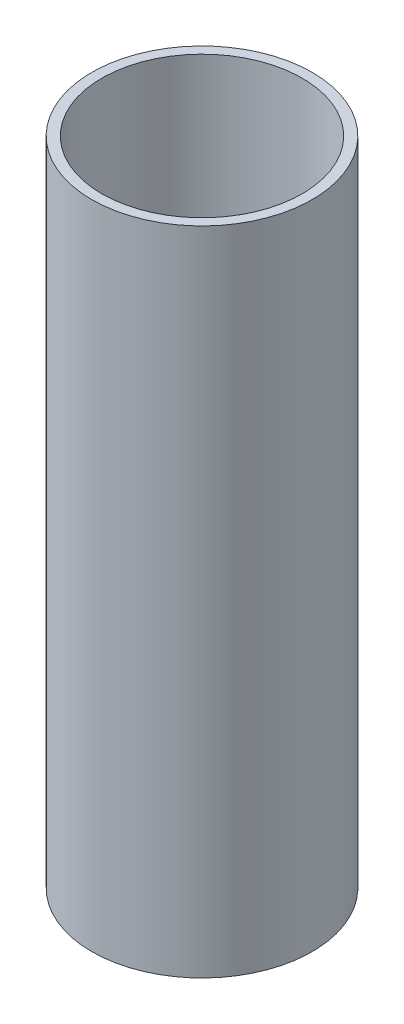
ISO-10303-21;
HEADER;
FILE_DESCRIPTION(('STEP AP214'),'2;1');
FILE_NAME('part.step','',(''),(''),'','','');
FILE_SCHEMA(('AUTOMOTIVE_DESIGN { 1 0 10303 214 1 1 1 1 }'));
ENDSEC;
DATA;
#1=APPLICATION_CONTEXT('core data for automotive mechanical design processes');
#2=APPLICATION_PROTOCOL_DEFINITION('international standard','automotive_design',2000,#1);
#3=PRODUCT_CONTEXT('',#1,'mechanical');
#4=PRODUCT('Part','Part','',(#3));
#5=PRODUCT_RELATED_PRODUCT_CATEGORY('part','',(#4));
#6=PRODUCT_DEFINITION_FORMATION('','',#4);
#7=PRODUCT_DEFINITION_CONTEXT('part definition',#1,'design');
#8=PRODUCT_DEFINITION('design','',#6,#7);
#9=PRODUCT_DEFINITION_SHAPE('','',#8);
#10=(LENGTH_UNIT() NAMED_UNIT(*) SI_UNIT(.MILLI.,.METRE.));
#11=(NAMED_UNIT(*) PLANE_ANGLE_UNIT() SI_UNIT($,.RADIAN.));
#12=(NAMED_UNIT(*) SI_UNIT($,.STERADIAN.) SOLID_ANGLE_UNIT());
#13=UNCERTAINTY_MEASURE_WITH_UNIT(LENGTH_MEASURE(1.E-05),#10,'distance_accuracy_value','');
#14=(GEOMETRIC_REPRESENTATION_CONTEXT(3) GLOBAL_UNCERTAINTY_ASSIGNED_CONTEXT((#13)) GLOBAL_UNIT_ASSIGNED_CONTEXT((#10,
#11,#12)) REPRESENTATION_CONTEXT('',''));
#15=CARTESIAN_POINT('',(0.,0.,0.));
#16=DIRECTION('',(0.,0.,1.));
#17=DIRECTION('',(1.,0.,0.));
#18=AXIS2_PLACEMENT_3D('',#15,#16,#17);
#19=CARTESIAN_POINT('',(0.,65.,0.));
#20=DIRECTION('',(0.,-1.,0.));
#21=DIRECTION('',(0.,0.,-1.));
#22=AXIS2_PLACEMENT_3D('',#19,#20,#21);
#23=CYLINDRICAL_SURFACE('',#22,11.);
#24=CARTESIAN_POINT('',(0.,65.,0.));
#25=DIRECTION('',(0.,1.,0.));
#26=DIRECTION('',(0.,0.,1.));
#27=AXIS2_PLACEMENT_3D('',#24,#25,#26);
#28=CIRCLE('',#27,11.);
#29=CARTESIAN_POINT('',(0.,65.,11.));
#30=VERTEX_POINT('',#29);
#31=EDGE_CURVE('E10',#30,#30,#28,.T.);
#32=ORIENTED_EDGE('',*,*,#31,.F.);
#33=EDGE_LOOP('',(#32));
#34=FACE_BOUND('',#33,.T.);
#35=CARTESIAN_POINT('',(0.,0.,0.));
#36=DIRECTION('',(0.,1.,0.));
#37=DIRECTION('',(0.,0.,1.));
#38=AXIS2_PLACEMENT_3D('',#35,#36,#37);
#39=CIRCLE('',#38,11.);
#40=CARTESIAN_POINT('',(0.,0.,11.));
#41=VERTEX_POINT('',#40);
#42=EDGE_CURVE('E42',#41,#41,#39,.T.);
#43=ORIENTED_EDGE('',*,*,#42,.T.);
#44=EDGE_LOOP('',(#43));
#45=FACE_BOUND('',#44,.T.);
#46=ADVANCED_FACE('F39',(#34,#45),#23,.T.);
#47=CARTESIAN_POINT('',(0.,65.,0.));
#48=DIRECTION('',(0.,1.,0.));
#49=DIRECTION('',(0.,0.,1.));
#50=AXIS2_PLACEMENT_3D('',#47,#48,#49);
#51=PLANE('',#50);
#52=CARTESIAN_POINT('',(0.,65.,0.));
#53=DIRECTION('',(0.,1.,0.));
#54=DIRECTION('',(0.,0.,1.));
#55=AXIS2_PLACEMENT_3D('',#52,#53,#54);
#56=CIRCLE('',#55,10.);
#57=CARTESIAN_POINT('',(0.,65.,10.));
#58=VERTEX_POINT('',#57);
#59=EDGE_CURVE('E51',#58,#58,#56,.T.);
#60=ORIENTED_EDGE('',*,*,#59,.F.);
#61=EDGE_LOOP('',(#60));
#62=FACE_BOUND('',#61,.T.);
#63=ORIENTED_EDGE('',*,*,#31,.T.);
#64=EDGE_LOOP('',(#63));
#65=FACE_BOUND('',#64,.T.);
#66=ADVANCED_FACE('F66',(#62,#65),#51,.T.);
#67=CARTESIAN_POINT('',(0.,0.,0.));
#68=DIRECTION('',(0.,1.,0.));
#69=DIRECTION('',(0.,0.,1.));
#70=AXIS2_PLACEMENT_3D('',#67,#68,#69);
#71=PLANE('',#70);
#72=ORIENTED_EDGE('',*,*,#42,.F.);
#73=EDGE_LOOP('',(#72));
#74=FACE_BOUND('',#73,.T.);
#75=ADVANCED_FACE('F62',(#74),#71,.F.);
#76=CARTESIAN_POINT('',(0.,1.,0.));
#77=DIRECTION('',(0.,1.,0.));
#78=DIRECTION('',(0.,0.,1.));
#79=AXIS2_PLACEMENT_3D('',#76,#77,#78);
#80=CYLINDRICAL_SURFACE('',#79,10.);
#81=CARTESIAN_POINT('',(0.,1.,0.));
#82=DIRECTION('',(0.,1.,0.));
#83=DIRECTION('',(0.,0.,1.));
#84=AXIS2_PLACEMENT_3D('',#81,#82,#83);
#85=CIRCLE('',#84,10.);
#86=CARTESIAN_POINT('',(0.,1.,10.));
#87=VERTEX_POINT('',#86);
#88=EDGE_CURVE('E49',#87,#87,#85,.T.);
#89=ORIENTED_EDGE('',*,*,#88,.F.);
#90=EDGE_LOOP('',(#89));
#91=FACE_BOUND('',#90,.T.);
#92=ORIENTED_EDGE('',*,*,#59,.T.);
#93=EDGE_LOOP('',(#92));
#94=FACE_BOUND('',#93,.T.);
#95=ADVANCED_FACE('F59',(#91,#94),#80,.F.);
#96=CARTESIAN_POINT('',(0.,1.,0.));
#97=DIRECTION('',(0.,1.,0.));
#98=DIRECTION('',(0.,0.,1.));
#99=AXIS2_PLACEMENT_3D('',#96,#97,#98);
#100=PLANE('',#99);
#101=ORIENTED_EDGE('',*,*,#88,.T.);
#102=EDGE_LOOP('',(#101));
#103=FACE_BOUND('',#102,.T.);
#104=ADVANCED_FACE('F57',(#103),#100,.T.);
#105=CLOSED_SHELL('',(#46,#66,#75,#95,#104));
#106=MANIFOLD_SOLID_BREP('B2',#105);
#107=ADVANCED_BREP_SHAPE_REPRESENTATION('',(#18,#106),#14);
#108=SHAPE_DEFINITION_REPRESENTATION(#9,#107);
ENDSEC;
END-ISO-10303-21;
